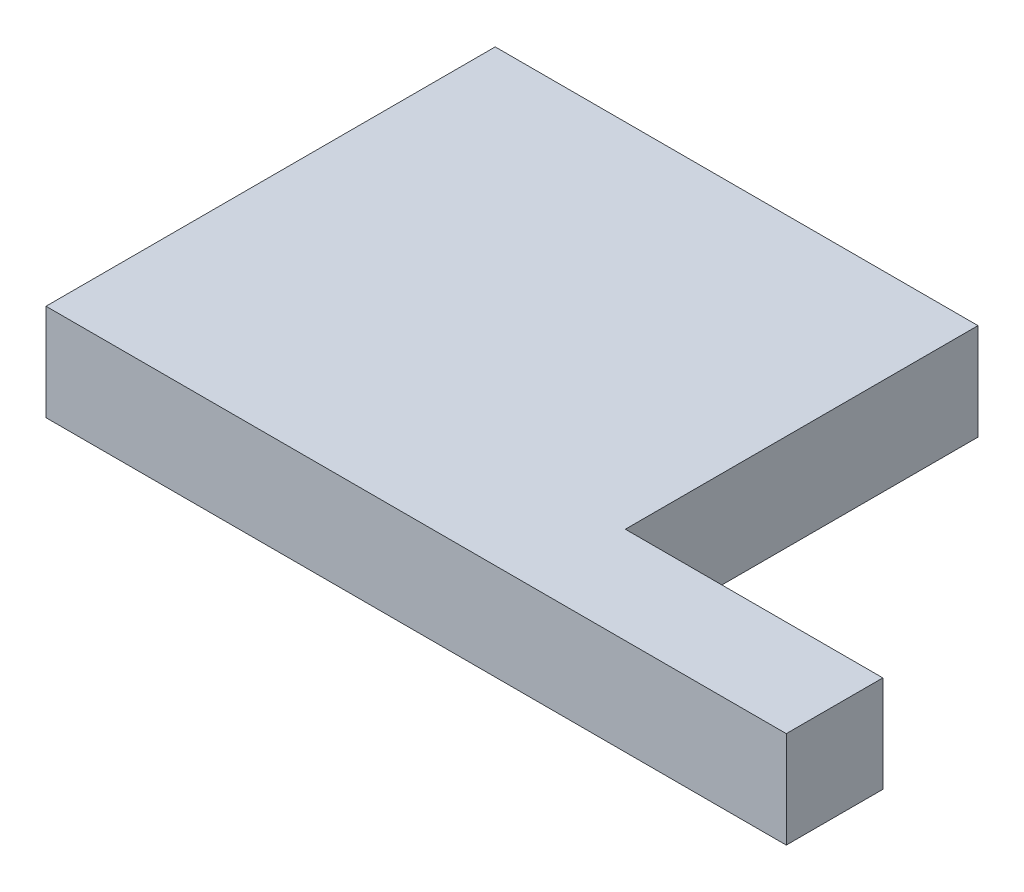
ISO-10303-21;
HEADER;
FILE_DESCRIPTION(('STEP AP214'),'2;1');
FILE_NAME('part.step','',(''),(''),'','','');
FILE_SCHEMA(('AUTOMOTIVE_DESIGN { 1 0 10303 214 1 1 1 1 }'));
ENDSEC;
DATA;
#1=APPLICATION_CONTEXT('core data for automotive mechanical design processes');
#2=APPLICATION_PROTOCOL_DEFINITION('international standard','automotive_design',2000,#1);
#3=PRODUCT_CONTEXT('',#1,'mechanical');
#4=PRODUCT('Part','Part','',(#3));
#5=PRODUCT_RELATED_PRODUCT_CATEGORY('part','',(#4));
#6=PRODUCT_DEFINITION_FORMATION('','',#4);
#7=PRODUCT_DEFINITION_CONTEXT('part definition',#1,'design');
#8=PRODUCT_DEFINITION('design','',#6,#7);
#9=PRODUCT_DEFINITION_SHAPE('','',#8);
#10=(LENGTH_UNIT() NAMED_UNIT(*) SI_UNIT(.MILLI.,.METRE.));
#11=(NAMED_UNIT(*) PLANE_ANGLE_UNIT() SI_UNIT($,.RADIAN.));
#12=(NAMED_UNIT(*) SI_UNIT($,.STERADIAN.) SOLID_ANGLE_UNIT());
#13=UNCERTAINTY_MEASURE_WITH_UNIT(LENGTH_MEASURE(1.E-05),#10,'distance_accuracy_value','');
#14=(GEOMETRIC_REPRESENTATION_CONTEXT(3) GLOBAL_UNCERTAINTY_ASSIGNED_CONTEXT((#13)) GLOBAL_UNIT_ASSIGNED_CONTEXT((#10,
#11,#12)) REPRESENTATION_CONTEXT('',''));
#15=CARTESIAN_POINT('',(0.,0.,0.));
#16=DIRECTION('',(0.,0.,1.));
#17=DIRECTION('',(1.,0.,0.));
#18=AXIS2_PLACEMENT_3D('',#15,#16,#17);
#19=CARTESIAN_POINT('',(-17.7002639673742,32.2393861531619,8.7627762728716));
#20=DIRECTION('',(1.,0.,0.));
#21=DIRECTION('',(0.,0.,-1.));
#22=AXIS2_PLACEMENT_3D('',#19,#20,#21);
#23=PLANE('',#22);
#24=DIRECTION('',(0.,0.,-1.));
#25=VECTOR('',#24,1.);
#26=CARTESIAN_POINT('',(-17.7002639673742,35.2393861531619,8.7627762728716));
#27=LINE('',#26,#25);
#28=CARTESIAN_POINT('',(-17.7002639673742,35.2393861531619,8.7627762728716));
#29=VERTEX_POINT('',#28);
#30=CARTESIAN_POINT('',(-17.7002639673742,35.2393861531619,-5.19404303980764));
#31=VERTEX_POINT('',#30);
#32=EDGE_CURVE('E120',#29,#31,#27,.T.);
#33=ORIENTED_EDGE('',*,*,#32,.T.);
#34=DIRECTION('',(0.,1.,0.));
#35=VECTOR('',#34,1.);
#36=CARTESIAN_POINT('',(-17.7002639673742,32.2393861531619,-5.19404303980764));
#37=LINE('',#36,#35);
#38=CARTESIAN_POINT('',(-17.7002639673742,32.2393861531619,-5.19404303980764));
#39=VERTEX_POINT('',#38);
#40=EDGE_CURVE('E40',#39,#31,#37,.T.);
#41=ORIENTED_EDGE('',*,*,#40,.F.);
#42=DIRECTION('',(0.,0.,-1.));
#43=VECTOR('',#42,1.);
#44=CARTESIAN_POINT('',(-17.7002639673742,32.2393861531619,8.7627762728716));
#45=LINE('',#44,#43);
#46=CARTESIAN_POINT('',(-17.7002639673742,32.2393861531619,8.7627762728716));
#47=VERTEX_POINT('',#46);
#48=EDGE_CURVE('E86',#47,#39,#45,.T.);
#49=ORIENTED_EDGE('',*,*,#48,.F.);
#50=DIRECTION('',(0.,1.,0.));
#51=VECTOR('',#50,1.);
#52=CARTESIAN_POINT('',(-17.7002639673742,32.2393861531619,8.7627762728716));
#53=LINE('',#52,#51);
#54=EDGE_CURVE('E11',#47,#29,#53,.T.);
#55=ORIENTED_EDGE('',*,*,#54,.T.);
#56=EDGE_LOOP('',(#33,#41,#49,#55));
#57=FACE_BOUND('',#56,.T.);
#58=ADVANCED_FACE('F32',(#57),#23,.F.);
#59=CARTESIAN_POINT('',(-2.70026396737417,32.2393861531619,-5.19404303980764));
#60=DIRECTION('',(0.,0.,1.));
#61=DIRECTION('',(1.,0.,0.));
#62=AXIS2_PLACEMENT_3D('',#59,#60,#61);
#63=PLANE('',#62);
#64=DIRECTION('',(1.,0.,0.));
#65=VECTOR('',#64,1.);
#66=CARTESIAN_POINT('',(-2.70026396737417,35.2393861531619,-5.19404303980764));
#67=LINE('',#66,#65);
#68=CARTESIAN_POINT('',(-2.70026396737417,35.2393861531619,-5.19404303980764));
#69=VERTEX_POINT('',#68);
#70=EDGE_CURVE('E123',#31,#69,#67,.T.);
#71=ORIENTED_EDGE('',*,*,#70,.T.);
#72=DIRECTION('',(0.,1.,0.));
#73=VECTOR('',#72,1.);
#74=CARTESIAN_POINT('',(-2.70026396737417,32.2393861531619,-5.19404303980764));
#75=LINE('',#74,#73);
#76=CARTESIAN_POINT('',(-2.70026396737417,32.2393861531619,-5.19404303980764));
#77=VERTEX_POINT('',#76);
#78=EDGE_CURVE('E109',#77,#69,#75,.T.);
#79=ORIENTED_EDGE('',*,*,#78,.F.);
#80=DIRECTION('',(1.,0.,0.));
#81=VECTOR('',#80,1.);
#82=CARTESIAN_POINT('',(-17.7002639673742,32.2393861531619,-5.19404303980764));
#83=LINE('',#82,#81);
#84=EDGE_CURVE('E100',#39,#77,#83,.T.);
#85=ORIENTED_EDGE('',*,*,#84,.F.);
#86=ORIENTED_EDGE('',*,*,#40,.T.);
#87=EDGE_LOOP('',(#71,#79,#85,#86));
#88=FACE_BOUND('',#87,.T.);
#89=ADVANCED_FACE('F134',(#88),#63,.F.);
#90=CARTESIAN_POINT('',(-2.70026396737417,32.2393861531619,5.76277627287161));
#91=DIRECTION('',(-1.,0.,0.));
#92=DIRECTION('',(0.,0.,1.));
#93=AXIS2_PLACEMENT_3D('',#90,#91,#92);
#94=PLANE('',#93);
#95=DIRECTION('',(0.,0.,1.));
#96=VECTOR('',#95,1.);
#97=CARTESIAN_POINT('',(-2.70026396737417,35.2393861531619,5.76277627287161));
#98=LINE('',#97,#96);
#99=CARTESIAN_POINT('',(-2.70026396737417,35.2393861531619,5.76277627287161));
#100=VERTEX_POINT('',#99);
#101=EDGE_CURVE('E108',#69,#100,#98,.T.);
#102=ORIENTED_EDGE('',*,*,#101,.T.);
#103=DIRECTION('',(0.,1.,0.));
#104=VECTOR('',#103,1.);
#105=CARTESIAN_POINT('',(-2.70026396737417,32.2393861531619,5.76277627287161));
#106=LINE('',#105,#104);
#107=CARTESIAN_POINT('',(-2.70026396737417,32.2393861531619,5.76277627287161));
#108=VERTEX_POINT('',#107);
#109=EDGE_CURVE('E105',#108,#100,#106,.T.);
#110=ORIENTED_EDGE('',*,*,#109,.F.);
#111=DIRECTION('',(0.,0.,1.));
#112=VECTOR('',#111,1.);
#113=CARTESIAN_POINT('',(-2.70026396737417,32.2393861531619,5.76277627287161));
#114=LINE('',#113,#112);
#115=EDGE_CURVE('E94',#77,#108,#114,.T.);
#116=ORIENTED_EDGE('',*,*,#115,.F.);
#117=ORIENTED_EDGE('',*,*,#78,.T.);
#118=EDGE_LOOP('',(#102,#110,#116,#117));
#119=FACE_BOUND('',#118,.T.);
#120=ADVANCED_FACE('F106',(#119),#94,.F.);
#121=CARTESIAN_POINT('',(5.29973603262584,32.2393861531619,5.76277627287161));
#122=DIRECTION('',(0.,0.,1.));
#123=DIRECTION('',(1.,0.,0.));
#124=AXIS2_PLACEMENT_3D('',#121,#122,#123);
#125=PLANE('',#124);
#126=DIRECTION('',(1.,0.,0.));
#127=VECTOR('',#126,1.);
#128=CARTESIAN_POINT('',(5.29973603262584,35.2393861531619,5.76277627287161));
#129=LINE('',#128,#127);
#130=CARTESIAN_POINT('',(5.29973603262584,35.2393861531619,5.76277627287161));
#131=VERTEX_POINT('',#130);
#132=EDGE_CURVE('E72',#100,#131,#129,.T.);
#133=ORIENTED_EDGE('',*,*,#132,.T.);
#134=DIRECTION('',(0.,1.,0.));
#135=VECTOR('',#134,1.);
#136=CARTESIAN_POINT('',(5.29973603262584,32.2393861531619,5.76277627287161));
#137=LINE('',#136,#135);
#138=CARTESIAN_POINT('',(5.29973603262584,32.2393861531619,5.76277627287161));
#139=VERTEX_POINT('',#138);
#140=EDGE_CURVE('E110',#139,#131,#137,.T.);
#141=ORIENTED_EDGE('',*,*,#140,.F.);
#142=DIRECTION('',(1.,0.,0.));
#143=VECTOR('',#142,1.);
#144=CARTESIAN_POINT('',(5.29973603262584,32.2393861531619,5.76277627287161));
#145=LINE('',#144,#143);
#146=EDGE_CURVE('E98',#108,#139,#145,.T.);
#147=ORIENTED_EDGE('',*,*,#146,.F.);
#148=ORIENTED_EDGE('',*,*,#109,.T.);
#149=EDGE_LOOP('',(#133,#141,#147,#148));
#150=FACE_BOUND('',#149,.T.);
#151=ADVANCED_FACE('F112',(#150),#125,.F.);
#152=CARTESIAN_POINT('',(5.29973603262584,32.2393861531619,8.7627762728716));
#153=DIRECTION('',(-1.,0.,0.));
#154=DIRECTION('',(0.,0.,1.));
#155=AXIS2_PLACEMENT_3D('',#152,#153,#154);
#156=PLANE('',#155);
#157=DIRECTION('',(0.,0.,1.));
#158=VECTOR('',#157,1.);
#159=CARTESIAN_POINT('',(5.29973603262584,35.2393861531619,8.7627762728716));
#160=LINE('',#159,#158);
#161=CARTESIAN_POINT('',(5.29973603262584,35.2393861531619,8.7627762728716));
#162=VERTEX_POINT('',#161);
#163=EDGE_CURVE('E79',#131,#162,#160,.T.);
#164=ORIENTED_EDGE('',*,*,#163,.T.);
#165=DIRECTION('',(0.,1.,0.));
#166=VECTOR('',#165,1.);
#167=CARTESIAN_POINT('',(5.29973603262584,32.2393861531619,8.7627762728716));
#168=LINE('',#167,#166);
#169=CARTESIAN_POINT('',(5.29973603262584,32.2393861531619,8.7627762728716));
#170=VERTEX_POINT('',#169);
#171=EDGE_CURVE('E116',#170,#162,#168,.T.);
#172=ORIENTED_EDGE('',*,*,#171,.F.);
#173=DIRECTION('',(0.,0.,1.));
#174=VECTOR('',#173,1.);
#175=CARTESIAN_POINT('',(5.29973603262584,32.2393861531619,8.7627762728716));
#176=LINE('',#175,#174);
#177=EDGE_CURVE('E114',#139,#170,#176,.T.);
#178=ORIENTED_EDGE('',*,*,#177,.F.);
#179=ORIENTED_EDGE('',*,*,#140,.T.);
#180=EDGE_LOOP('',(#164,#172,#178,#179));
#181=FACE_BOUND('',#180,.T.);
#182=ADVANCED_FACE('F140',(#181),#156,.F.);
#183=CARTESIAN_POINT('',(-9.70026396737417,32.2393861531619,8.7627762728716));
#184=DIRECTION('',(0.,0.,-1.));
#185=DIRECTION('',(-1.,0.,0.));
#186=AXIS2_PLACEMENT_3D('',#183,#184,#185);
#187=PLANE('',#186);
#188=DIRECTION('',(-1.,0.,0.));
#189=VECTOR('',#188,1.);
#190=CARTESIAN_POINT('',(-9.70026396737417,35.2393861531619,8.7627762728716));
#191=LINE('',#190,#189);
#192=EDGE_CURVE('E128',#162,#29,#191,.T.);
#193=ORIENTED_EDGE('',*,*,#192,.T.);
#194=ORIENTED_EDGE('',*,*,#54,.F.);
#195=DIRECTION('',(-1.,0.,0.));
#196=VECTOR('',#195,1.);
#197=CARTESIAN_POINT('',(-9.70026396737417,32.2393861531619,8.7627762728716));
#198=LINE('',#197,#196);
#199=EDGE_CURVE('E48',#170,#47,#198,.T.);
#200=ORIENTED_EDGE('',*,*,#199,.F.);
#201=ORIENTED_EDGE('',*,*,#171,.T.);
#202=EDGE_LOOP('',(#193,#194,#200,#201));
#203=FACE_BOUND('',#202,.T.);
#204=ADVANCED_FACE('F139',(#203),#187,.F.);
#205=CARTESIAN_POINT('',(0.,32.2393861531619,0.));
#206=DIRECTION('',(0.,-1.,0.));
#207=DIRECTION('',(0.,0.,-1.));
#208=AXIS2_PLACEMENT_3D('',#205,#206,#207);
#209=PLANE('',#208);
#210=ORIENTED_EDGE('',*,*,#199,.T.);
#211=ORIENTED_EDGE('',*,*,#48,.T.);
#212=ORIENTED_EDGE('',*,*,#84,.T.);
#213=ORIENTED_EDGE('',*,*,#115,.T.);
#214=ORIENTED_EDGE('',*,*,#146,.T.);
#215=ORIENTED_EDGE('',*,*,#177,.T.);
#216=EDGE_LOOP('',(#210,#211,#212,#213,#214,#215));
#217=FACE_BOUND('',#216,.T.);
#218=ADVANCED_FACE('F96',(#217),#209,.T.);
#219=CARTESIAN_POINT('',(0.,35.2393861531619,0.));
#220=DIRECTION('',(0.,-1.,0.));
#221=DIRECTION('',(0.,0.,-1.));
#222=AXIS2_PLACEMENT_3D('',#219,#220,#221);
#223=PLANE('',#222);
#224=ORIENTED_EDGE('',*,*,#32,.F.);
#225=ORIENTED_EDGE('',*,*,#192,.F.);
#226=ORIENTED_EDGE('',*,*,#163,.F.);
#227=ORIENTED_EDGE('',*,*,#132,.F.);
#228=ORIENTED_EDGE('',*,*,#101,.F.);
#229=ORIENTED_EDGE('',*,*,#70,.F.);
#230=EDGE_LOOP('',(#224,#225,#226,#227,#228,#229));
#231=FACE_BOUND('',#230,.T.);
#232=ADVANCED_FACE('F138',(#231),#223,.F.);
#233=CLOSED_SHELL('',(#58,#89,#120,#151,#182,#204,#218,#232));
#234=MANIFOLD_SOLID_BREP('B2',#233);
#235=ADVANCED_BREP_SHAPE_REPRESENTATION('',(#18,#234),#14);
#236=SHAPE_DEFINITION_REPRESENTATION(#9,#235);
ENDSEC;
END-ISO-10303-21;
